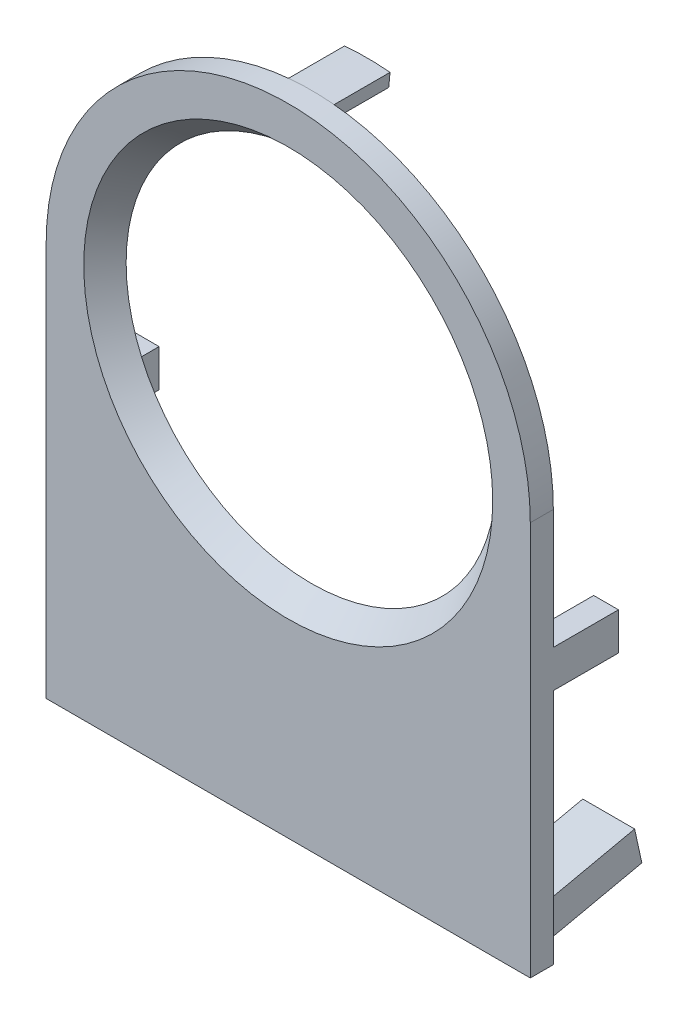
ISO-10303-21;
HEADER;
FILE_DESCRIPTION(('STEP AP214'),'2;1');
FILE_NAME('part.step','',(''),(''),'','','');
FILE_SCHEMA(('AUTOMOTIVE_DESIGN { 1 0 10303 214 1 1 1 1 }'));
ENDSEC;
DATA;
#1=APPLICATION_CONTEXT('core data for automotive mechanical design processes');
#2=APPLICATION_PROTOCOL_DEFINITION('international standard','automotive_design',2000,#1);
#3=PRODUCT_CONTEXT('',#1,'mechanical');
#4=PRODUCT('Part','Part','',(#3));
#5=PRODUCT_RELATED_PRODUCT_CATEGORY('part','',(#4));
#6=PRODUCT_DEFINITION_FORMATION('','',#4);
#7=PRODUCT_DEFINITION_CONTEXT('part definition',#1,'design');
#8=PRODUCT_DEFINITION('design','',#6,#7);
#9=PRODUCT_DEFINITION_SHAPE('','',#8);
#10=(LENGTH_UNIT() NAMED_UNIT(*) SI_UNIT(.MILLI.,.METRE.));
#11=(NAMED_UNIT(*) PLANE_ANGLE_UNIT() SI_UNIT($,.RADIAN.));
#12=(NAMED_UNIT(*) SI_UNIT($,.STERADIAN.) SOLID_ANGLE_UNIT());
#13=UNCERTAINTY_MEASURE_WITH_UNIT(LENGTH_MEASURE(1.E-05),#10,'distance_accuracy_value','');
#14=(GEOMETRIC_REPRESENTATION_CONTEXT(3) GLOBAL_UNCERTAINTY_ASSIGNED_CONTEXT((#13)) GLOBAL_UNIT_ASSIGNED_CONTEXT((#10,
#11,#12)) REPRESENTATION_CONTEXT('',''));
#15=CARTESIAN_POINT('',(0.,0.,0.));
#16=DIRECTION('',(0.,0.,1.));
#17=DIRECTION('',(1.,0.,0.));
#18=AXIS2_PLACEMENT_3D('',#15,#16,#17);
#19=CARTESIAN_POINT('',(0.,0.,42.));
#20=DIRECTION('',(0.,0.,1.));
#21=DIRECTION('',(1.,0.,0.));
#22=AXIS2_PLACEMENT_3D('',#19,#20,#21);
#23=PLANE('',#22);
#24=CARTESIAN_POINT('',(0.,0.,42.));
#25=DIRECTION('',(0.,0.,1.));
#26=DIRECTION('',(1.,0.,0.));
#27=AXIS2_PLACEMENT_3D('',#24,#25,#26);
#28=CIRCLE('',#27,16.0618007376455);
#29=CARTESIAN_POINT('',(16.0618007376455,0.,42.));
#30=VERTEX_POINT('',#29);
#31=EDGE_CURVE('E50',#30,#30,#28,.T.);
#32=ORIENTED_EDGE('',*,*,#31,.T.);
#33=EDGE_LOOP('',(#32));
#34=FACE_BOUND('',#33,.T.);
#35=DIRECTION('',(0.,-1.,0.));
#36=VECTOR('',#35,1.);
#37=CARTESIAN_POINT('',(-19.25,-21.4379492860773,42.));
#38=LINE('',#37,#36);
#39=CARTESIAN_POINT('',(-19.25,-31.2047703418054,42.));
#40=VERTEX_POINT('',#39);
#41=CARTESIAN_POINT('',(-19.25,-34.2047703418054,42.));
#42=VERTEX_POINT('',#41);
#43=EDGE_CURVE('E225',#40,#42,#38,.T.);
#44=ORIENTED_EDGE('',*,*,#43,.T.);
#45=DIRECTION('',(1.,0.,0.));
#46=VECTOR('',#45,1.);
#47=CARTESIAN_POINT('',(-21.,-34.2047703418054,42.));
#48=LINE('',#47,#46);
#49=CARTESIAN_POINT('',(-21.,-34.2047703418054,42.));
#50=VERTEX_POINT('',#49);
#51=EDGE_CURVE('E361',#50,#42,#48,.T.);
#52=ORIENTED_EDGE('',*,*,#51,.F.);
#53=DIRECTION('',(0.,-1.,0.));
#54=VECTOR('',#53,1.);
#55=CARTESIAN_POINT('',(-21.,-14.0641329223108,42.));
#56=LINE('',#55,#54);
#57=CARTESIAN_POINT('',(-21.,-13.7641329223108,42.));
#58=VERTEX_POINT('',#57);
#59=EDGE_CURVE('E297',#58,#50,#56,.T.);
#60=ORIENTED_EDGE('',*,*,#59,.F.);
#61=DIRECTION('',(1.,0.,0.));
#62=VECTOR('',#61,1.);
#63=CARTESIAN_POINT('',(-21.,-13.7641329223108,42.));
#64=LINE('',#63,#62);
#65=CARTESIAN_POINT('',(-18.85,-13.7641329223108,42.));
#66=VERTEX_POINT('',#65);
#67=EDGE_CURVE('E465',#58,#66,#64,.T.);
#68=ORIENTED_EDGE('',*,*,#67,.T.);
#69=DIRECTION('',(0.,1.,0.));
#70=VECTOR('',#69,1.);
#71=CARTESIAN_POINT('',(-18.85,-10.2141329223108,42.));
#72=LINE('',#71,#70);
#73=CARTESIAN_POINT('',(-18.85,-10.5141329223108,42.));
#74=VERTEX_POINT('',#73);
#75=EDGE_CURVE('E490',#66,#74,#72,.T.);
#76=ORIENTED_EDGE('',*,*,#75,.T.);
#77=DIRECTION('',(-1.,0.,0.));
#78=VECTOR('',#77,1.);
#79=CARTESIAN_POINT('',(-18.85,-10.5141329223108,42.));
#80=LINE('',#79,#78);
#81=CARTESIAN_POINT('',(-21.,-10.5141329223108,42.));
#82=VERTEX_POINT('',#81);
#83=EDGE_CURVE('E472',#74,#82,#80,.T.);
#84=ORIENTED_EDGE('',*,*,#83,.T.);
#85=CARTESIAN_POINT('',(-21.,0.,42.));
#86=VERTEX_POINT('',#85);
#87=EDGE_CURVE('E304',#86,#82,#56,.T.);
#88=ORIENTED_EDGE('',*,*,#87,.F.);
#89=CARTESIAN_POINT('',(0.,0.,42.));
#90=DIRECTION('',(0.,0.,1.));
#91=DIRECTION('',(1.,0.,0.));
#92=AXIS2_PLACEMENT_3D('',#89,#90,#91);
#93=CIRCLE('',#92,21.);
#94=CARTESIAN_POINT('',(-1.78913083156493,20.9236471693523,42.));
#95=VERTEX_POINT('',#94);
#96=EDGE_CURVE('E307',#95,#86,#93,.T.);
#97=ORIENTED_EDGE('',*,*,#96,.F.);
#98=CARTESIAN_POINT('',(1.98333797025892,20.9060681525341,42.));
#99=CARTESIAN_POINT('',(1.32410684495105,20.9688240892851,42.));
#100=CARTESIAN_POINT('',(0.00385608887355169,21.0318291108314,42.));
#101=CARTESIAN_POINT('',(-1.31639466720395,20.9691910581041,42.));
#102=CARTESIAN_POINT('',(-1.97181873184604,20.9071615352025,42.));
#103=B_SPLINE_CURVE_WITH_KNOTS('',3,(#98,#99,#100,#101,#102),.UNSPECIFIED.,.F.,.F.,(4,1,4),
(0.632808650119649,0.654019793730495,0.675107394358108),.UNSPECIFIED.);
#104=CARTESIAN_POINT('',(-1.97181873184604,20.9071615352025,42.));
#105=VERTEX_POINT('',#104);
#106=EDGE_CURVE('E234',#95,#105,#103,.T.);
#107=ORIENTED_EDGE('',*,*,#106,.T.);
#108=DIRECTION('',(0.0942192787541509,-0.99555146904168,0.));
#109=VECTOR('',#108,1.);
#110=CARTESIAN_POINT('',(-1.85894403589857,19.7144908752906,42.));
#111=LINE('',#110,#109);
#112=CARTESIAN_POINT('',(-1.85894403589857,19.7144908752906,42.));
#113=VERTEX_POINT('',#112);
#114=EDGE_CURVE('E340',#105,#113,#111,.T.);
#115=ORIENTED_EDGE('',*,*,#114,.T.);
#116=CARTESIAN_POINT('',(-1.85894403589857,19.7144908752906,42.));
#117=CARTESIAN_POINT('',(-1.54909634243908,19.7438149505485,42.));
#118=CARTESIAN_POINT('',(-0.927804945098241,19.7878796223772,42.));
#119=CARTESIAN_POINT('',(0.00545184072156578,19.8098164315136,42.));
#120=CARTESIAN_POINT('',(0.938704489057926,19.7873617674215,42.));
#121=CARTESIAN_POINT('',(1.55997378818764,19.7429545593892,42.));
#122=CARTESIAN_POINT('',(1.86980684063082,19.7134597999701,42.));
#123=B_SPLINE_CURVE_WITH_KNOTS('',3,(#116,#117,#118,#119,#120,#121,#122),.UNSPECIFIED.,.F.,.F.,
(4,1,1,1,4),(0.632808650119649,0.643383336179264,0.653958022238878,0.664532708298493,
0.675107394358108),.UNSPECIFIED.);
#124=CARTESIAN_POINT('',(1.86980684063082,19.7134597999701,42.));
#125=VERTEX_POINT('',#124);
#126=EDGE_CURVE('E586',#113,#125,#123,.T.);
#127=ORIENTED_EDGE('',*,*,#126,.T.);
#128=DIRECTION('',(0.0947672200568778,0.995499459569261,0.));
#129=VECTOR('',#128,1.);
#130=CARTESIAN_POINT('',(1.86980684063082,19.7134597999701,42.));
#131=LINE('',#130,#129);
#132=CARTESIAN_POINT('',(1.98333797025896,20.9060681525341,42.));
#133=VERTEX_POINT('',#132);
#134=EDGE_CURVE('E331',#125,#133,#131,.T.);
#135=ORIENTED_EDGE('',*,*,#134,.T.);
#136=CARTESIAN_POINT('',(1.78913083154189,20.9236471693542,42.));
#137=VERTEX_POINT('',#136);
#138=EDGE_CURVE('E337',#133,#137,#103,.T.);
#139=ORIENTED_EDGE('',*,*,#138,.T.);
#140=CARTESIAN_POINT('',(21.,0.,42.));
#141=VERTEX_POINT('',#140);
#142=EDGE_CURVE('E288',#141,#137,#93,.T.);
#143=ORIENTED_EDGE('',*,*,#142,.F.);
#144=DIRECTION('',(0.,1.,0.));
#145=VECTOR('',#144,1.);
#146=CARTESIAN_POINT('',(21.,0.,42.));
#147=LINE('',#146,#145);
#148=CARTESIAN_POINT('',(21.,-10.3641329223108,42.));
#149=VERTEX_POINT('',#148);
#150=EDGE_CURVE('E311',#149,#141,#147,.T.);
#151=ORIENTED_EDGE('',*,*,#150,.F.);
#152=DIRECTION('',(-1.,0.,0.));
#153=VECTOR('',#152,1.);
#154=CARTESIAN_POINT('',(18.85,-10.3641329223108,42.));
#155=LINE('',#154,#153);
#156=CARTESIAN_POINT('',(18.85,-10.3641329223108,42.));
#157=VERTEX_POINT('',#156);
#158=EDGE_CURVE('E484',#149,#157,#155,.T.);
#159=ORIENTED_EDGE('',*,*,#158,.T.);
#160=DIRECTION('',(0.,-1.,0.));
#161=VECTOR('',#160,1.);
#162=CARTESIAN_POINT('',(18.85,-10.0641329223108,42.));
#163=LINE('',#162,#161);
#164=CARTESIAN_POINT('',(18.85,-13.6141329223108,42.));
#165=VERTEX_POINT('',#164);
#166=EDGE_CURVE('E341',#157,#165,#163,.T.);
#167=ORIENTED_EDGE('',*,*,#166,.T.);
#168=DIRECTION('',(1.,0.,0.));
#169=VECTOR('',#168,1.);
#170=CARTESIAN_POINT('',(18.85,-13.6141329223108,42.));
#171=LINE('',#170,#169);
#172=CARTESIAN_POINT('',(21.,-13.6141329223108,42.));
#173=VERTEX_POINT('',#172);
#174=EDGE_CURVE('E474',#165,#173,#171,.T.);
#175=ORIENTED_EDGE('',*,*,#174,.T.);
#176=CARTESIAN_POINT('',(21.,-34.2047703418054,42.));
#177=VERTEX_POINT('',#176);
#178=EDGE_CURVE('E302',#177,#173,#147,.T.);
#179=ORIENTED_EDGE('',*,*,#178,.F.);
#180=CARTESIAN_POINT('',(19.25,-34.2047703418054,42.));
#181=VERTEX_POINT('',#180);
#182=EDGE_CURVE('E364',#181,#177,#48,.T.);
#183=ORIENTED_EDGE('',*,*,#182,.F.);
#184=DIRECTION('',(0.,-1.,0.));
#185=VECTOR('',#184,1.);
#186=CARTESIAN_POINT('',(19.25,-21.4379492860773,42.));
#187=LINE('',#186,#185);
#188=CARTESIAN_POINT('',(19.25,-31.2047703418054,42.));
#189=VERTEX_POINT('',#188);
#190=EDGE_CURVE('E409',#189,#181,#187,.T.);
#191=ORIENTED_EDGE('',*,*,#190,.F.);
#192=DIRECTION('',(-1.,0.,0.));
#193=VECTOR('',#192,1.);
#194=CARTESIAN_POINT('',(19.5,-31.2047703418054,42.));
#195=LINE('',#194,#193);
#196=CARTESIAN_POINT('',(14.75,-31.2047703418054,42.));
#197=VERTEX_POINT('',#196);
#198=EDGE_CURVE('E455',#189,#197,#195,.T.);
#199=ORIENTED_EDGE('',*,*,#198,.T.);
#200=DIRECTION('',(0.,-1.,0.));
#201=VECTOR('',#200,1.);
#202=CARTESIAN_POINT('',(14.75,-21.4379492860773,42.));
#203=LINE('',#202,#201);
#204=CARTESIAN_POINT('',(14.75,-34.2047703418054,42.));
#205=VERTEX_POINT('',#204);
#206=EDGE_CURVE('E400',#197,#205,#203,.T.);
#207=ORIENTED_EDGE('',*,*,#206,.T.);
#208=CARTESIAN_POINT('',(-14.75,-34.2047703418054,42.));
#209=VERTEX_POINT('',#208);
#210=EDGE_CURVE('E363',#209,#205,#48,.T.);
#211=ORIENTED_EDGE('',*,*,#210,.F.);
#212=DIRECTION('',(0.,-1.,0.));
#213=VECTOR('',#212,1.);
#214=CARTESIAN_POINT('',(-14.75,-21.4379492860773,42.));
#215=LINE('',#214,#213);
#216=CARTESIAN_POINT('',(-14.75,-31.2047703418054,42.));
#217=VERTEX_POINT('',#216);
#218=EDGE_CURVE('E390',#217,#209,#215,.T.);
#219=ORIENTED_EDGE('',*,*,#218,.F.);
#220=DIRECTION('',(1.,0.,0.));
#221=VECTOR('',#220,1.);
#222=CARTESIAN_POINT('',(-19.5,-31.2047703418054,42.));
#223=LINE('',#222,#221);
#224=EDGE_CURVE('E385',#40,#217,#223,.T.);
#225=ORIENTED_EDGE('',*,*,#224,.F.);
#226=EDGE_LOOP('',(#44,#52,#60,#68,#76,#84,#88,#97,#107,#115,#127,#135,#139,#143,#151,#159,#167,
#175,#179,#183,#191,#199,#207,#211,#219,#225));
#227=FACE_BOUND('',#226,.T.);
#228=ADVANCED_FACE('F41',(#34,#227),#23,.F.);
#229=CARTESIAN_POINT('',(0.,0.,44.));
#230=DIRECTION('',(0.,0.,1.));
#231=DIRECTION('',(1.,0.,0.));
#232=AXIS2_PLACEMENT_3D('',#229,#230,#231);
#233=PLANE('',#232);
#234=CARTESIAN_POINT('',(0.,0.,44.));
#235=DIRECTION('',(0.,0.,1.));
#236=DIRECTION('',(1.,0.,0.));
#237=AXIS2_PLACEMENT_3D('',#234,#235,#236);
#238=CIRCLE('',#237,17.74);
#239=CARTESIAN_POINT('',(17.74,0.,44.));
#240=VERTEX_POINT('',#239);
#241=EDGE_CURVE('E11',#240,#240,#238,.F.);
#242=ORIENTED_EDGE('',*,*,#241,.T.);
#243=EDGE_LOOP('',(#242));
#244=FACE_BOUND('',#243,.T.);
#245=DIRECTION('',(0.,1.,0.));
#246=VECTOR('',#245,1.);
#247=CARTESIAN_POINT('',(21.,-34.2047703418054,44.));
#248=LINE('',#247,#246);
#249=CARTESIAN_POINT('',(21.,-34.2047703418054,44.));
#250=VERTEX_POINT('',#249);
#251=CARTESIAN_POINT('',(21.,0.,44.));
#252=VERTEX_POINT('',#251);
#253=EDGE_CURVE('E362',#250,#252,#248,.T.);
#254=ORIENTED_EDGE('',*,*,#253,.T.);
#255=CARTESIAN_POINT('',(0.,0.,44.));
#256=DIRECTION('',(0.,0.,1.));
#257=DIRECTION('',(1.,0.,0.));
#258=AXIS2_PLACEMENT_3D('',#255,#256,#257);
#259=CIRCLE('',#258,21.);
#260=CARTESIAN_POINT('',(-21.,0.,44.));
#261=VERTEX_POINT('',#260);
#262=EDGE_CURVE('E367',#252,#261,#259,.T.);
#263=ORIENTED_EDGE('',*,*,#262,.T.);
#264=DIRECTION('',(0.,-1.,0.));
#265=VECTOR('',#264,1.);
#266=CARTESIAN_POINT('',(-21.,0.,44.));
#267=LINE('',#266,#265);
#268=CARTESIAN_POINT('',(-21.,-34.2047703418054,44.));
#269=VERTEX_POINT('',#268);
#270=EDGE_CURVE('E524',#261,#269,#267,.T.);
#271=ORIENTED_EDGE('',*,*,#270,.T.);
#272=DIRECTION('',(1.,0.,0.));
#273=VECTOR('',#272,1.);
#274=CARTESIAN_POINT('',(-21.,-34.2047703418054,44.));
#275=LINE('',#274,#273);
#276=EDGE_CURVE('E360',#269,#250,#275,.T.);
#277=ORIENTED_EDGE('',*,*,#276,.T.);
#278=EDGE_LOOP('',(#254,#263,#271,#277));
#279=FACE_BOUND('',#278,.T.);
#280=ADVANCED_FACE('F257',(#244,#279),#233,.T.);
#281=CARTESIAN_POINT('',(21.,0.,44.));
#282=DIRECTION('',(-1.,0.,0.));
#283=DIRECTION('',(0.,-1.,0.));
#284=AXIS2_PLACEMENT_3D('',#281,#282,#283);
#285=PLANE('',#284);
#286=DIRECTION('',(0.,0.,-1.));
#287=VECTOR('',#286,1.);
#288=CARTESIAN_POINT('',(21.,-13.6141329223108,44.1708293346092));
#289=LINE('',#288,#287);
#290=CARTESIAN_POINT('',(21.,-13.6141329223108,36.35));
#291=VERTEX_POINT('',#290);
#292=EDGE_CURVE('E471',#173,#291,#289,.T.);
#293=ORIENTED_EDGE('',*,*,#292,.T.);
#294=DIRECTION('',(0.,-1.,0.));
#295=VECTOR('',#294,1.);
#296=CARTESIAN_POINT('',(21.,-15.1139710254063,36.35));
#297=LINE('',#296,#295);
#298=CARTESIAN_POINT('',(21.,-10.3641329223108,36.35));
#299=VERTEX_POINT('',#298);
#300=EDGE_CURVE('E434',#299,#291,#297,.T.);
#301=ORIENTED_EDGE('',*,*,#300,.F.);
#302=DIRECTION('',(0.,0.,-1.));
#303=VECTOR('',#302,1.);
#304=CARTESIAN_POINT('',(21.,-10.3641329223108,44.1708293346092));
#305=LINE('',#304,#303);
#306=EDGE_CURVE('E477',#149,#299,#305,.T.);
#307=ORIENTED_EDGE('',*,*,#306,.F.);
#308=ORIENTED_EDGE('',*,*,#150,.T.);
#309=DIRECTION('',(0.,0.,-1.));
#310=VECTOR('',#309,1.);
#311=CARTESIAN_POINT('',(21.,0.,44.));
#312=LINE('',#311,#310);
#313=EDGE_CURVE('E347',#252,#141,#312,.T.);
#314=ORIENTED_EDGE('',*,*,#313,.F.);
#315=ORIENTED_EDGE('',*,*,#253,.F.);
#316=DIRECTION('',(0.,0.,-1.));
#317=VECTOR('',#316,1.);
#318=CARTESIAN_POINT('',(21.,-34.2047703418054,44.));
#319=LINE('',#318,#317);
#320=EDGE_CURVE('E359',#250,#177,#319,.T.);
#321=ORIENTED_EDGE('',*,*,#320,.T.);
#322=ORIENTED_EDGE('',*,*,#178,.T.);
#323=EDGE_LOOP('',(#293,#301,#307,#308,#314,#315,#321,#322));
#324=FACE_BOUND('',#323,.T.);
#325=ADVANCED_FACE('F263',(#324),#285,.F.);
#326=CARTESIAN_POINT('',(0.,0.,44.));
#327=DIRECTION('',(0.,0.,-1.));
#328=DIRECTION('',(-1.,0.,0.));
#329=AXIS2_PLACEMENT_3D('',#326,#327,#328);
#330=CYLINDRICAL_SURFACE('',#329,21.);
#331=ORIENTED_EDGE('',*,*,#142,.T.);
#332=CARTESIAN_POINT('',(-1.78913083156494,20.9236471693523,42.));
#333=CARTESIAN_POINT('',(-1.19413395904744,20.9747222381822,42.));
#334=CARTESIAN_POINT('',(-7.7056958903976E-12,21.0261149822509,42.));
#335=CARTESIAN_POINT('',(1.19413395903203,20.9747222381829,42.));
#336=CARTESIAN_POINT('',(1.7891308315419,20.9236471693543,42.));
#337=B_SPLINE_CURVE_WITH_KNOTS('',3,(#332,#333,#334,#335,#336),.UNSPECIFIED.,.F.,.F.,(4,1,4),
(0.634890712877089,0.654019793730742,0.673148874584148),.UNSPECIFIED.);
#338=EDGE_CURVE('E298',#137,#95,#337,.F.);
#339=ORIENTED_EDGE('',*,*,#338,.T.);
#340=ORIENTED_EDGE('',*,*,#96,.T.);
#341=DIRECTION('',(0.,0.,-1.));
#342=VECTOR('',#341,1.);
#343=CARTESIAN_POINT('',(-21.,0.,44.));
#344=LINE('',#343,#342);
#345=EDGE_CURVE('E353',#261,#86,#344,.T.);
#346=ORIENTED_EDGE('',*,*,#345,.F.);
#347=ORIENTED_EDGE('',*,*,#262,.F.);
#348=ORIENTED_EDGE('',*,*,#313,.T.);
#349=EDGE_LOOP('',(#331,#339,#340,#346,#347,#348));
#350=FACE_BOUND('',#349,.T.);
#351=ADVANCED_FACE('F276',(#350),#330,.T.);
#352=CARTESIAN_POINT('',(-21.,-14.0641329223108,44.));
#353=DIRECTION('',(1.,0.,0.));
#354=DIRECTION('',(0.,1.,0.));
#355=AXIS2_PLACEMENT_3D('',#352,#353,#354);
#356=PLANE('',#355);
#357=DIRECTION('',(0.,0.,-1.));
#358=VECTOR('',#357,1.);
#359=CARTESIAN_POINT('',(-21.,-10.5141329223108,44.1708293346092));
#360=LINE('',#359,#358);
#361=CARTESIAN_POINT('',(-21.,-10.5141329223108,36.35));
#362=VERTEX_POINT('',#361);
#363=EDGE_CURVE('E480',#82,#362,#360,.T.);
#364=ORIENTED_EDGE('',*,*,#363,.T.);
#365=DIRECTION('',(0.,-1.,0.));
#366=VECTOR('',#365,1.);
#367=CARTESIAN_POINT('',(-21.,-14.0641329223108,36.35));
#368=LINE('',#367,#366);
#369=CARTESIAN_POINT('',(-21.,-13.7641329223108,36.35));
#370=VERTEX_POINT('',#369);
#371=EDGE_CURVE('E439',#362,#370,#368,.T.);
#372=ORIENTED_EDGE('',*,*,#371,.T.);
#373=DIRECTION('',(0.,0.,-1.));
#374=VECTOR('',#373,1.);
#375=CARTESIAN_POINT('',(-21.,-13.7641329223108,44.1708293346092));
#376=LINE('',#375,#374);
#377=EDGE_CURVE('E379',#58,#370,#376,.T.);
#378=ORIENTED_EDGE('',*,*,#377,.F.);
#379=ORIENTED_EDGE('',*,*,#59,.T.);
#380=DIRECTION('',(0.,0.,-1.));
#381=VECTOR('',#380,1.);
#382=CARTESIAN_POINT('',(-21.,-34.2047703418054,44.));
#383=LINE('',#382,#381);
#384=EDGE_CURVE('E356',#269,#50,#383,.T.);
#385=ORIENTED_EDGE('',*,*,#384,.F.);
#386=ORIENTED_EDGE('',*,*,#270,.F.);
#387=ORIENTED_EDGE('',*,*,#345,.T.);
#388=ORIENTED_EDGE('',*,*,#87,.T.);
#389=EDGE_LOOP('',(#364,#372,#378,#379,#385,#386,#387,#388));
#390=FACE_BOUND('',#389,.T.);
#391=ADVANCED_FACE('F272',(#390),#356,.F.);
#392=CARTESIAN_POINT('',(-21.,-34.2047703418054,44.));
#393=DIRECTION('',(0.,1.,0.));
#394=DIRECTION('',(0.,0.,1.));
#395=AXIS2_PLACEMENT_3D('',#392,#393,#394);
#396=PLANE('',#395);
#397=ORIENTED_EDGE('',*,*,#51,.T.);
#398=DIRECTION('',(-1.,0.,0.));
#399=VECTOR('',#398,1.);
#400=CARTESIAN_POINT('',(-19.5,-34.2047703418054,42.));
#401=LINE('',#400,#399);
#402=EDGE_CURVE('E224',#209,#42,#401,.T.);
#403=ORIENTED_EDGE('',*,*,#402,.F.);
#404=ORIENTED_EDGE('',*,*,#210,.T.);
#405=DIRECTION('',(-1.,0.,0.));
#406=VECTOR('',#405,1.);
#407=CARTESIAN_POINT('',(19.5,-34.2047703418054,42.));
#408=LINE('',#407,#406);
#409=EDGE_CURVE('E458',#181,#205,#408,.T.);
#410=ORIENTED_EDGE('',*,*,#409,.F.);
#411=ORIENTED_EDGE('',*,*,#182,.T.);
#412=ORIENTED_EDGE('',*,*,#320,.F.);
#413=ORIENTED_EDGE('',*,*,#276,.F.);
#414=ORIENTED_EDGE('',*,*,#384,.T.);
#415=EDGE_LOOP('',(#397,#403,#404,#410,#411,#412,#413,#414));
#416=FACE_BOUND('',#415,.T.);
#417=ADVANCED_FACE('F268',(#416),#396,.F.);
#418=CARTESIAN_POINT('',(1.98333797025892,20.9060681525341,37.));
#419=CARTESIAN_POINT('',(1.32410684495105,20.9688240892851,37.));
#420=CARTESIAN_POINT('',(0.00385608887355169,21.0318291108314,37.));
#421=CARTESIAN_POINT('',(-1.31639466720395,20.9691910581041,37.));
#422=CARTESIAN_POINT('',(-1.97181873184604,20.9071615352025,37.));
#423=B_SPLINE_CURVE_WITH_KNOTS('',3,(#418,#419,#420,#421,#422),.UNSPECIFIED.,.F.,.F.,(4,1,4),
(0.632808650119649,0.654019793730495,0.675107394358108),.UNSPECIFIED.);
#424=DIRECTION('',(0.,0.,1.));
#425=VECTOR('',#424,1.);
#426=SURFACE_OF_LINEAR_EXTRUSION('',#423,#425);
#427=CARTESIAN_POINT('',(1.98333797025892,20.9060681525341,37.15));
#428=CARTESIAN_POINT('',(1.32410684495105,20.9688240892851,37.15));
#429=CARTESIAN_POINT('',(0.00385608887355169,21.0318291108314,37.15));
#430=CARTESIAN_POINT('',(-1.31639466720395,20.9691910581041,37.15));
#431=CARTESIAN_POINT('',(-1.97181873184604,20.9071615352025,37.15));
#432=B_SPLINE_CURVE_WITH_KNOTS('',3,(#427,#428,#429,#430,#431),.UNSPECIFIED.,.F.,.F.,(4,1,4),
(0.632808650119649,0.654019793730495,0.675107394358108),.UNSPECIFIED.);
#433=CARTESIAN_POINT('',(-1.97181873184604,20.9071615352025,37.15));
#434=VERTEX_POINT('',#433);
#435=CARTESIAN_POINT('',(1.98333797025896,20.9060681525341,37.15));
#436=VERTEX_POINT('',#435);
#437=EDGE_CURVE('E418',#434,#436,#432,.F.);
#438=ORIENTED_EDGE('',*,*,#437,.F.);
#439=DIRECTION('',(0.,0.,1.));
#440=VECTOR('',#439,1.);
#441=CARTESIAN_POINT('',(-1.97181873184604,20.9071615352025,37.));
#442=LINE('',#441,#440);
#443=EDGE_CURVE('E335',#434,#105,#442,.T.);
#444=ORIENTED_EDGE('',*,*,#443,.T.);
#445=ORIENTED_EDGE('',*,*,#106,.F.);
#446=ORIENTED_EDGE('',*,*,#338,.F.);
#447=ORIENTED_EDGE('',*,*,#138,.F.);
#448=DIRECTION('',(0.,0.,1.));
#449=VECTOR('',#448,1.);
#450=CARTESIAN_POINT('',(1.98333797025896,20.9060681525341,37.));
#451=LINE('',#450,#449);
#452=EDGE_CURVE('E317',#436,#133,#451,.T.);
#453=ORIENTED_EDGE('',*,*,#452,.F.);
#454=EDGE_LOOP('',(#438,#444,#445,#446,#447,#453));
#455=FACE_BOUND('',#454,.T.);
#456=ADVANCED_FACE('F271',(#455),#426,.T.);
#457=CARTESIAN_POINT('',(1.86980684063082,19.7134597999701,37.));
#458=DIRECTION('',(0.995499459569261,-0.0947672200568778,0.));
#459=DIRECTION('',(0.0947672200568778,0.995499459569261,0.));
#460=AXIS2_PLACEMENT_3D('',#457,#458,#459);
#461=PLANE('',#460);
#462=DIRECTION('',(-0.0947672200568778,-0.995499459569261,0.));
#463=VECTOR('',#462,1.);
#464=CARTESIAN_POINT('',(2.06990503626383,21.8154276058622,37.15));
#465=LINE('',#464,#463);
#466=CARTESIAN_POINT('',(1.86980684063082,19.7134597999701,37.15));
#467=VERTEX_POINT('',#466);
#468=EDGE_CURVE('E412',#436,#467,#465,.T.);
#469=ORIENTED_EDGE('',*,*,#468,.F.);
#470=ORIENTED_EDGE('',*,*,#452,.T.);
#471=ORIENTED_EDGE('',*,*,#134,.F.);
#472=DIRECTION('',(0.,0.,1.));
#473=VECTOR('',#472,1.);
#474=CARTESIAN_POINT('',(1.86980684063082,19.7134597999701,37.));
#475=LINE('',#474,#473);
#476=EDGE_CURVE('E321',#467,#125,#475,.T.);
#477=ORIENTED_EDGE('',*,*,#476,.F.);
#478=EDGE_LOOP('',(#469,#470,#471,#477));
#479=FACE_BOUND('',#478,.T.);
#480=ADVANCED_FACE('F511',(#479),#461,.T.);
#481=CARTESIAN_POINT('',(-1.85894403589857,19.7144908752906,37.));
#482=CARTESIAN_POINT('',(-1.54909634243908,19.7438149505485,37.));
#483=CARTESIAN_POINT('',(-0.927804945098241,19.7878796223772,37.));
#484=CARTESIAN_POINT('',(0.00545184072156578,19.8098164315136,37.));
#485=CARTESIAN_POINT('',(0.938704489057926,19.7873617674215,37.));
#486=CARTESIAN_POINT('',(1.55997378818764,19.7429545593892,37.));
#487=CARTESIAN_POINT('',(1.86980684063082,19.7134597999701,37.));
#488=B_SPLINE_CURVE_WITH_KNOTS('',3,(#481,#482,#483,#484,#485,#486,#487),.UNSPECIFIED.,.F.,.F.,
(4,1,1,1,4),(0.632808650119649,0.643383336179264,0.653958022238878,0.664532708298493,
0.675107394358108),.UNSPECIFIED.);
#489=DIRECTION('',(0.,0.,1.));
#490=VECTOR('',#489,1.);
#491=SURFACE_OF_LINEAR_EXTRUSION('',#488,#490);
#492=CARTESIAN_POINT('',(-1.85894403589857,19.7144908752906,37.15));
#493=CARTESIAN_POINT('',(-1.54909634243908,19.7438149505485,37.15));
#494=CARTESIAN_POINT('',(-0.927804945098241,19.7878796223772,37.15));
#495=CARTESIAN_POINT('',(0.00545184072156578,19.8098164315136,37.15));
#496=CARTESIAN_POINT('',(0.938704489057926,19.7873617674215,37.15));
#497=CARTESIAN_POINT('',(1.55997378818764,19.7429545593892,37.15));
#498=CARTESIAN_POINT('',(1.86980684063082,19.7134597999701,37.15));
#499=B_SPLINE_CURVE_WITH_KNOTS('',3,(#492,#493,#494,#495,#496,#497,#498),.UNSPECIFIED.,.F.,.F.,
(4,1,1,1,4),(0.632808650119649,0.643383336179264,0.653958022238878,0.664532708298493,
0.675107394358108),.UNSPECIFIED.);
#500=CARTESIAN_POINT('',(-1.85894403589857,19.7144908752906,37.15));
#501=VERTEX_POINT('',#500);
#502=EDGE_CURVE('E414',#467,#501,#499,.F.);
#503=ORIENTED_EDGE('',*,*,#502,.F.);
#504=ORIENTED_EDGE('',*,*,#476,.T.);
#505=ORIENTED_EDGE('',*,*,#126,.F.);
#506=DIRECTION('',(0.,0.,1.));
#507=VECTOR('',#506,1.);
#508=CARTESIAN_POINT('',(-1.85894403589857,19.7144908752906,37.));
#509=LINE('',#508,#507);
#510=EDGE_CURVE('E328',#501,#113,#509,.T.);
#511=ORIENTED_EDGE('',*,*,#510,.F.);
#512=EDGE_LOOP('',(#503,#504,#505,#511));
#513=FACE_BOUND('',#512,.T.);
#514=ADVANCED_FACE('F573',(#513),#491,.T.);
#515=CARTESIAN_POINT('',(-1.85894403589857,19.7144908752906,37.));
#516=DIRECTION('',(-0.99555146904168,-0.0942192787541509,0.));
#517=DIRECTION('',(0.0942192787541509,-0.99555146904168,0.));
#518=AXIS2_PLACEMENT_3D('',#515,#516,#517);
#519=PLANE('',#518);
#520=DIRECTION('',(-0.0942192787541509,0.99555146904168,0.));
#521=VECTOR('',#520,1.);
#522=CARTESIAN_POINT('',(-1.85894403589857,19.7144908752906,37.15));
#523=LINE('',#522,#521);
#524=EDGE_CURVE('E228',#501,#434,#523,.T.);
#525=ORIENTED_EDGE('',*,*,#524,.F.);
#526=ORIENTED_EDGE('',*,*,#510,.T.);
#527=ORIENTED_EDGE('',*,*,#114,.F.);
#528=ORIENTED_EDGE('',*,*,#443,.F.);
#529=EDGE_LOOP('',(#525,#526,#527,#528));
#530=FACE_BOUND('',#529,.T.);
#531=ADVANCED_FACE('F513',(#530),#519,.T.);
#532=CARTESIAN_POINT('',(-18.85,-10.2141329223108,46.380314673286));
#533=DIRECTION('',(-1.,0.,0.));
#534=DIRECTION('',(0.,0.,1.));
#535=AXIS2_PLACEMENT_3D('',#532,#533,#534);
#536=PLANE('',#535);
#537=DIRECTION('',(0.,0.,-1.));
#538=VECTOR('',#537,1.);
#539=CARTESIAN_POINT('',(-18.85,-13.7641329223108,44.1708293346092));
#540=LINE('',#539,#538);
#541=CARTESIAN_POINT('',(-18.85,-13.7641329223108,36.35));
#542=VERTEX_POINT('',#541);
#543=EDGE_CURVE('E462',#66,#542,#540,.T.);
#544=ORIENTED_EDGE('',*,*,#543,.T.);
#545=DIRECTION('',(0.,1.,0.));
#546=VECTOR('',#545,1.);
#547=CARTESIAN_POINT('',(-18.85,-10.2141329223108,36.35));
#548=LINE('',#547,#546);
#549=CARTESIAN_POINT('',(-18.85,-10.5141329223108,36.35));
#550=VERTEX_POINT('',#549);
#551=EDGE_CURVE('E436',#542,#550,#548,.T.);
#552=ORIENTED_EDGE('',*,*,#551,.T.);
#553=DIRECTION('',(0.,0.,-1.));
#554=VECTOR('',#553,1.);
#555=CARTESIAN_POINT('',(-18.85,-10.5141329223108,44.1708293346092));
#556=LINE('',#555,#554);
#557=EDGE_CURVE('E467',#74,#550,#556,.T.);
#558=ORIENTED_EDGE('',*,*,#557,.F.);
#559=ORIENTED_EDGE('',*,*,#75,.F.);
#560=EDGE_LOOP('',(#544,#552,#558,#559));
#561=FACE_BOUND('',#560,.T.);
#562=ADVANCED_FACE('F542',(#561),#536,.F.);
#563=CARTESIAN_POINT('',(18.85,-10.0641329223108,46.380314673286));
#564=DIRECTION('',(1.,0.,0.));
#565=DIRECTION('',(0.,0.,-1.));
#566=AXIS2_PLACEMENT_3D('',#563,#564,#565);
#567=PLANE('',#566);
#568=DIRECTION('',(0.,0.,-1.));
#569=VECTOR('',#568,1.);
#570=CARTESIAN_POINT('',(18.85,-10.3641329223108,44.1708293346092));
#571=LINE('',#570,#569);
#572=CARTESIAN_POINT('',(18.85,-10.3641329223108,36.35));
#573=VERTEX_POINT('',#572);
#574=EDGE_CURVE('E487',#157,#573,#571,.T.);
#575=ORIENTED_EDGE('',*,*,#574,.T.);
#576=DIRECTION('',(0.,-1.,0.));
#577=VECTOR('',#576,1.);
#578=CARTESIAN_POINT('',(18.85,-10.0641329223108,36.35));
#579=LINE('',#578,#577);
#580=CARTESIAN_POINT('',(18.85,-13.6141329223108,36.35));
#581=VERTEX_POINT('',#580);
#582=EDGE_CURVE('E447',#573,#581,#579,.T.);
#583=ORIENTED_EDGE('',*,*,#582,.T.);
#584=DIRECTION('',(0.,0.,-1.));
#585=VECTOR('',#584,1.);
#586=CARTESIAN_POINT('',(18.85,-13.6141329223108,44.1708293346092));
#587=LINE('',#586,#585);
#588=EDGE_CURVE('E468',#165,#581,#587,.T.);
#589=ORIENTED_EDGE('',*,*,#588,.F.);
#590=ORIENTED_EDGE('',*,*,#166,.F.);
#591=EDGE_LOOP('',(#575,#583,#589,#590));
#592=FACE_BOUND('',#591,.T.);
#593=ADVANCED_FACE('F565',(#592),#567,.F.);
#594=CARTESIAN_POINT('',(18.85,-10.3641329223108,44.1708293346092));
#595=DIRECTION('',(0.,-1.,0.));
#596=DIRECTION('',(0.,0.,-1.));
#597=AXIS2_PLACEMENT_3D('',#594,#595,#596);
#598=PLANE('',#597);
#599=ORIENTED_EDGE('',*,*,#306,.T.);
#600=DIRECTION('',(-1.,0.,0.));
#601=VECTOR('',#600,1.);
#602=CARTESIAN_POINT('',(18.85,-10.3641329223108,36.35));
#603=LINE('',#602,#601);
#604=EDGE_CURVE('E450',#299,#573,#603,.T.);
#605=ORIENTED_EDGE('',*,*,#604,.T.);
#606=ORIENTED_EDGE('',*,*,#574,.F.);
#607=ORIENTED_EDGE('',*,*,#158,.F.);
#608=EDGE_LOOP('',(#599,#605,#606,#607));
#609=FACE_BOUND('',#608,.T.);
#610=ADVANCED_FACE('F556',(#609),#598,.F.);
#611=CARTESIAN_POINT('',(18.85,-13.6141329223108,44.1708293346092));
#612=DIRECTION('',(0.,1.,0.));
#613=DIRECTION('',(0.,0.,1.));
#614=AXIS2_PLACEMENT_3D('',#611,#612,#613);
#615=PLANE('',#614);
#616=ORIENTED_EDGE('',*,*,#588,.T.);
#617=DIRECTION('',(1.,0.,0.));
#618=VECTOR('',#617,1.);
#619=CARTESIAN_POINT('',(18.85,-13.6141329223108,36.35));
#620=LINE('',#619,#618);
#621=EDGE_CURVE('E444',#581,#291,#620,.T.);
#622=ORIENTED_EDGE('',*,*,#621,.T.);
#623=ORIENTED_EDGE('',*,*,#292,.F.);
#624=ORIENTED_EDGE('',*,*,#174,.F.);
#625=EDGE_LOOP('',(#616,#622,#623,#624));
#626=FACE_BOUND('',#625,.T.);
#627=ADVANCED_FACE('F548',(#626),#615,.F.);
#628=CARTESIAN_POINT('',(-21.,-13.7641329223108,44.1708293346092));
#629=DIRECTION('',(0.,1.,0.));
#630=DIRECTION('',(0.,0.,1.));
#631=AXIS2_PLACEMENT_3D('',#628,#629,#630);
#632=PLANE('',#631);
#633=ORIENTED_EDGE('',*,*,#377,.T.);
#634=DIRECTION('',(1.,0.,0.));
#635=VECTOR('',#634,1.);
#636=CARTESIAN_POINT('',(-21.,-13.7641329223108,36.35));
#637=LINE('',#636,#635);
#638=EDGE_CURVE('E441',#370,#542,#637,.T.);
#639=ORIENTED_EDGE('',*,*,#638,.T.);
#640=ORIENTED_EDGE('',*,*,#543,.F.);
#641=ORIENTED_EDGE('',*,*,#67,.F.);
#642=EDGE_LOOP('',(#633,#639,#640,#641));
#643=FACE_BOUND('',#642,.T.);
#644=ADVANCED_FACE('F546',(#643),#632,.F.);
#645=CARTESIAN_POINT('',(-18.85,-10.5141329223108,44.1708293346092));
#646=DIRECTION('',(0.,-1.,0.));
#647=DIRECTION('',(0.,0.,-1.));
#648=AXIS2_PLACEMENT_3D('',#645,#646,#647);
#649=PLANE('',#648);
#650=ORIENTED_EDGE('',*,*,#557,.T.);
#651=DIRECTION('',(-1.,0.,0.));
#652=VECTOR('',#651,1.);
#653=CARTESIAN_POINT('',(-18.85,-10.5141329223108,36.35));
#654=LINE('',#653,#652);
#655=EDGE_CURVE('E229',#550,#362,#654,.T.);
#656=ORIENTED_EDGE('',*,*,#655,.T.);
#657=ORIENTED_EDGE('',*,*,#363,.F.);
#658=ORIENTED_EDGE('',*,*,#83,.F.);
#659=EDGE_LOOP('',(#650,#656,#657,#658));
#660=FACE_BOUND('',#659,.T.);
#661=ADVANCED_FACE('F540',(#660),#649,.F.);
#662=CARTESIAN_POINT('',(19.5,-32.072761245289,32.2299162126228));
#663=DIRECTION('',(0.,0.977008378737724,0.213200909651636));
#664=DIRECTION('',(0.,-0.213200909651636,0.977008378737724));
#665=AXIS2_PLACEMENT_3D('',#662,#663,#664);
#666=PLANE('',#665);
#667=ORIENTED_EDGE('',*,*,#409,.T.);
#668=DIRECTION('',(0.,-0.213200909651636,0.977008378737724));
#669=VECTOR('',#668,1.);
#670=CARTESIAN_POINT('',(14.75,-32.1473815636671,32.571869145181));
#671=LINE('',#670,#669);
#672=CARTESIAN_POINT('',(14.75,-32.1473815636671,32.571869145181));
#673=VERTEX_POINT('',#672);
#674=EDGE_CURVE('E387',#673,#205,#671,.T.);
#675=ORIENTED_EDGE('',*,*,#674,.F.);
#676=DIRECTION('',(1.,0.,0.));
#677=VECTOR('',#676,1.);
#678=CARTESIAN_POINT('',(19.5,-32.1473815636671,32.571869145181));
#679=LINE('',#678,#677);
#680=CARTESIAN_POINT('',(19.25,-32.1473815636671,32.571869145181));
#681=VERTEX_POINT('',#680);
#682=EDGE_CURVE('E432',#673,#681,#679,.T.);
#683=ORIENTED_EDGE('',*,*,#682,.T.);
#684=DIRECTION('',(0.,0.213200909651636,-0.977008378737723));
#685=VECTOR('',#684,1.);
#686=CARTESIAN_POINT('',(19.25,-34.2047703418054,42.));
#687=LINE('',#686,#685);
#688=EDGE_CURVE('E403',#181,#681,#687,.T.);
#689=ORIENTED_EDGE('',*,*,#688,.F.);
#690=EDGE_LOOP('',(#667,#675,#683,#689));
#691=FACE_BOUND('',#690,.T.);
#692=ADVANCED_FACE('F554',(#691),#666,.F.);
#693=CARTESIAN_POINT('',(19.5,-29.072761245289,32.2299162126228));
#694=DIRECTION('',(0.,0.977008378737724,0.213200909651636));
#695=DIRECTION('',(0.,-0.213200909651636,0.977008378737724));
#696=AXIS2_PLACEMENT_3D('',#693,#694,#695);
#697=PLANE('',#696);
#698=DIRECTION('',(0.,-0.213200909651636,0.977008378737724));
#699=VECTOR('',#698,1.);
#700=CARTESIAN_POINT('',(14.75,-28.7034343470447,30.5374493527604));
#701=LINE('',#700,#699);
#702=CARTESIAN_POINT('',(14.75,-29.283745447296,33.1967663704334));
#703=VERTEX_POINT('',#702);
#704=EDGE_CURVE('E397',#703,#197,#701,.T.);
#705=ORIENTED_EDGE('',*,*,#704,.T.);
#706=ORIENTED_EDGE('',*,*,#198,.F.);
#707=DIRECTION('',(0.,0.213200909651636,-0.977008378737724));
#708=VECTOR('',#707,1.);
#709=CARTESIAN_POINT('',(19.25,-30.760823125183,39.9655802075794));
#710=LINE('',#709,#708);
#711=CARTESIAN_POINT('',(19.25,-29.283745447296,33.1967663704334));
#712=VERTEX_POINT('',#711);
#713=EDGE_CURVE('E406',#189,#712,#710,.T.);
#714=ORIENTED_EDGE('',*,*,#713,.T.);
#715=DIRECTION('',(1.,0.,0.));
#716=VECTOR('',#715,1.);
#717=CARTESIAN_POINT('',(19.5,-29.283745447296,33.1967663704334));
#718=LINE('',#717,#716);
#719=EDGE_CURVE('E430',#703,#712,#718,.T.);
#720=ORIENTED_EDGE('',*,*,#719,.F.);
#721=EDGE_LOOP('',(#705,#706,#714,#720));
#722=FACE_BOUND('',#721,.T.);
#723=ADVANCED_FACE('F560',(#722),#697,.T.);
#724=CARTESIAN_POINT('',(-19.5,-29.072761245289,32.2299162126228));
#725=DIRECTION('',(0.,-0.977008378737724,-0.213200909651636));
#726=DIRECTION('',(0.,0.213200909651636,-0.977008378737724));
#727=AXIS2_PLACEMENT_3D('',#724,#725,#726);
#728=PLANE('',#727);
#729=DIRECTION('',(-1.,0.,0.));
#730=VECTOR('',#729,1.);
#731=CARTESIAN_POINT('',(-19.5,-29.283745447296,33.1967663704334));
#732=LINE('',#731,#730);
#733=CARTESIAN_POINT('',(-14.75,-29.283745447296,33.1967663704334));
#734=VERTEX_POINT('',#733);
#735=CARTESIAN_POINT('',(-19.25,-29.283745447296,33.1967663704334));
#736=VERTEX_POINT('',#735);
#737=EDGE_CURVE('E425',#734,#736,#732,.T.);
#738=ORIENTED_EDGE('',*,*,#737,.T.);
#739=DIRECTION('',(0.,0.213200909651636,-0.977008378737724));
#740=VECTOR('',#739,1.);
#741=CARTESIAN_POINT('',(-19.25,-30.760823125183,39.9655802075794));
#742=LINE('',#741,#740);
#743=EDGE_CURVE('E65',#40,#736,#742,.T.);
#744=ORIENTED_EDGE('',*,*,#743,.F.);
#745=ORIENTED_EDGE('',*,*,#224,.T.);
#746=DIRECTION('',(0.,-0.213200909651636,0.977008378737724));
#747=VECTOR('',#746,1.);
#748=CARTESIAN_POINT('',(-14.75,-28.7034343470447,30.5374493527604));
#749=LINE('',#748,#747);
#750=EDGE_CURVE('E392',#734,#217,#749,.T.);
#751=ORIENTED_EDGE('',*,*,#750,.F.);
#752=EDGE_LOOP('',(#738,#744,#745,#751));
#753=FACE_BOUND('',#752,.T.);
#754=ADVANCED_FACE('F614',(#753),#728,.F.);
#755=CARTESIAN_POINT('',(-19.5,-32.072761245289,32.2299162126228));
#756=DIRECTION('',(0.,0.977008378737724,0.213200909651636));
#757=DIRECTION('',(0.,-0.213200909651636,0.977008378737724));
#758=AXIS2_PLACEMENT_3D('',#755,#756,#757);
#759=PLANE('',#758);
#760=ORIENTED_EDGE('',*,*,#402,.T.);
#761=DIRECTION('',(0.,-0.213200909651636,0.977008378737724));
#762=VECTOR('',#761,1.);
#763=CARTESIAN_POINT('',(-19.25,-34.2047703418054,42.));
#764=LINE('',#763,#762);
#765=CARTESIAN_POINT('',(-19.25,-32.1473815636671,32.571869145181));
#766=VERTEX_POINT('',#765);
#767=EDGE_CURVE('E211',#766,#42,#764,.T.);
#768=ORIENTED_EDGE('',*,*,#767,.F.);
#769=DIRECTION('',(1.,0.,0.));
#770=VECTOR('',#769,1.);
#771=CARTESIAN_POINT('',(-19.5,-32.1473815636671,32.571869145181));
#772=LINE('',#771,#770);
#773=CARTESIAN_POINT('',(-14.75,-32.1473815636671,32.571869145181));
#774=VERTEX_POINT('',#773);
#775=EDGE_CURVE('E222',#766,#774,#772,.T.);
#776=ORIENTED_EDGE('',*,*,#775,.T.);
#777=DIRECTION('',(0.,0.213200909651636,-0.977008378737724));
#778=VECTOR('',#777,1.);
#779=CARTESIAN_POINT('',(-14.75,-32.1473815636671,32.571869145181));
#780=LINE('',#779,#778);
#781=EDGE_CURVE('E57',#209,#774,#780,.T.);
#782=ORIENTED_EDGE('',*,*,#781,.F.);
#783=EDGE_LOOP('',(#760,#768,#776,#782));
#784=FACE_BOUND('',#783,.T.);
#785=ADVANCED_FACE('F221',(#784),#759,.F.);
#786=CARTESIAN_POINT('',(-33.95,-15.1139710254062,36.35));
#787=DIRECTION('',(0.,0.,1.));
#788=DIRECTION('',(1.,0.,0.));
#789=AXIS2_PLACEMENT_3D('',#786,#787,#788);
#790=PLANE('',#789);
#791=ORIENTED_EDGE('',*,*,#371,.F.);
#792=ORIENTED_EDGE('',*,*,#655,.F.);
#793=ORIENTED_EDGE('',*,*,#551,.F.);
#794=ORIENTED_EDGE('',*,*,#638,.F.);
#795=EDGE_LOOP('',(#791,#792,#793,#794));
#796=FACE_BOUND('',#795,.T.);
#797=ADVANCED_FACE('F544',(#796),#790,.F.);
#798=ORIENTED_EDGE('',*,*,#300,.T.);
#799=ORIENTED_EDGE('',*,*,#621,.F.);
#800=ORIENTED_EDGE('',*,*,#582,.F.);
#801=ORIENTED_EDGE('',*,*,#604,.F.);
#802=EDGE_LOOP('',(#798,#799,#800,#801));
#803=FACE_BOUND('',#802,.T.);
#804=ADVANCED_FACE('F608',(#803),#790,.F.);
#805=CARTESIAN_POINT('',(-35.45,-28.8047584770046,33.3012899958187));
#806=DIRECTION('',(0.,-0.213200909651641,0.977008378737722));
#807=DIRECTION('',(0.,-0.977008378737723,-0.213200909651641));
#808=AXIS2_PLACEMENT_3D('',#805,#806,#807);
#809=PLANE('',#808);
#810=ORIENTED_EDGE('',*,*,#775,.F.);
#811=DIRECTION('',(0.,0.977008378737723,0.213200909651641));
#812=VECTOR('',#811,1.);
#813=CARTESIAN_POINT('',(-19.25,-28.8047584770046,33.3012899958187));
#814=LINE('',#813,#812);
#815=EDGE_CURVE('E208',#766,#736,#814,.T.);
#816=ORIENTED_EDGE('',*,*,#815,.T.);
#817=ORIENTED_EDGE('',*,*,#737,.F.);
#818=DIRECTION('',(0.,-0.977008378737723,-0.213200909651641));
#819=VECTOR('',#818,1.);
#820=CARTESIAN_POINT('',(-14.75,-28.8047584770046,33.3012899958187));
#821=LINE('',#820,#819);
#822=EDGE_CURVE('E217',#734,#774,#821,.T.);
#823=ORIENTED_EDGE('',*,*,#822,.T.);
#824=EDGE_LOOP('',(#810,#816,#817,#823));
#825=FACE_BOUND('',#824,.T.);
#826=ADVANCED_FACE('F227',(#825),#809,.F.);
#827=ORIENTED_EDGE('',*,*,#682,.F.);
#828=DIRECTION('',(0.,0.977008378737723,0.213200909651641));
#829=VECTOR('',#828,1.);
#830=CARTESIAN_POINT('',(14.75,-28.8047584770046,33.3012899958187));
#831=LINE('',#830,#829);
#832=EDGE_CURVE('E240',#673,#703,#831,.T.);
#833=ORIENTED_EDGE('',*,*,#832,.T.);
#834=ORIENTED_EDGE('',*,*,#719,.T.);
#835=DIRECTION('',(0.,-0.977008378737723,-0.213200909651641));
#836=VECTOR('',#835,1.);
#837=CARTESIAN_POINT('',(19.25,-28.8047584770046,33.3012899958187));
#838=LINE('',#837,#836);
#839=EDGE_CURVE('E231',#712,#681,#838,.T.);
#840=ORIENTED_EDGE('',*,*,#839,.T.);
#841=EDGE_LOOP('',(#827,#833,#834,#840));
#842=FACE_BOUND('',#841,.T.);
#843=ADVANCED_FACE('F595',(#842),#809,.F.);
#844=CARTESIAN_POINT('',(-52.6327902670671,27.0228863479877,37.15));
#845=DIRECTION('',(0.,0.,1.));
#846=DIRECTION('',(1.,0.,0.));
#847=AXIS2_PLACEMENT_3D('',#844,#845,#846);
#848=PLANE('',#847);
#849=ORIENTED_EDGE('',*,*,#437,.T.);
#850=ORIENTED_EDGE('',*,*,#468,.T.);
#851=ORIENTED_EDGE('',*,*,#502,.T.);
#852=ORIENTED_EDGE('',*,*,#524,.T.);
#853=EDGE_LOOP('',(#849,#850,#851,#852));
#854=FACE_BOUND('',#853,.T.);
#855=ADVANCED_FACE('F592',(#854),#848,.F.);
#856=CARTESIAN_POINT('',(19.25,-21.4379492860773,42.));
#857=DIRECTION('',(-1.,0.,0.));
#858=DIRECTION('',(0.,0.,1.));
#859=AXIS2_PLACEMENT_3D('',#856,#857,#858);
#860=PLANE('',#859);
#861=ORIENTED_EDGE('',*,*,#713,.F.);
#862=ORIENTED_EDGE('',*,*,#190,.T.);
#863=ORIENTED_EDGE('',*,*,#688,.T.);
#864=ORIENTED_EDGE('',*,*,#839,.F.);
#865=EDGE_LOOP('',(#861,#862,#863,#864));
#866=FACE_BOUND('',#865,.T.);
#867=ADVANCED_FACE('F594',(#866),#860,.F.);
#868=CARTESIAN_POINT('',(14.75,-19.380560507939,32.571869145181));
#869=DIRECTION('',(1.,0.,0.));
#870=DIRECTION('',(0.,0.,-1.));
#871=AXIS2_PLACEMENT_3D('',#868,#869,#870);
#872=PLANE('',#871);
#873=ORIENTED_EDGE('',*,*,#674,.T.);
#874=ORIENTED_EDGE('',*,*,#206,.F.);
#875=ORIENTED_EDGE('',*,*,#704,.F.);
#876=ORIENTED_EDGE('',*,*,#832,.F.);
#877=EDGE_LOOP('',(#873,#874,#875,#876));
#878=FACE_BOUND('',#877,.T.);
#879=ADVANCED_FACE('F601',(#878),#872,.F.);
#880=CARTESIAN_POINT('',(-14.75,-19.380560507939,32.571869145181));
#881=DIRECTION('',(-1.,0.,0.));
#882=DIRECTION('',(0.,0.,1.));
#883=AXIS2_PLACEMENT_3D('',#880,#881,#882);
#884=PLANE('',#883);
#885=ORIENTED_EDGE('',*,*,#750,.T.);
#886=ORIENTED_EDGE('',*,*,#218,.T.);
#887=ORIENTED_EDGE('',*,*,#781,.T.);
#888=ORIENTED_EDGE('',*,*,#822,.F.);
#889=EDGE_LOOP('',(#885,#886,#887,#888));
#890=FACE_BOUND('',#889,.T.);
#891=ADVANCED_FACE('F253',(#890),#884,.F.);
#892=CARTESIAN_POINT('',(-19.25,-21.4379492860773,42.));
#893=DIRECTION('',(1.,0.,0.));
#894=DIRECTION('',(0.,0.,-1.));
#895=AXIS2_PLACEMENT_3D('',#892,#893,#894);
#896=PLANE('',#895);
#897=ORIENTED_EDGE('',*,*,#767,.T.);
#898=ORIENTED_EDGE('',*,*,#43,.F.);
#899=ORIENTED_EDGE('',*,*,#743,.T.);
#900=ORIENTED_EDGE('',*,*,#815,.F.);
#901=EDGE_LOOP('',(#897,#898,#899,#900));
#902=FACE_BOUND('',#901,.T.);
#903=ADVANCED_FACE('F210',(#902),#896,.F.);
#904=CARTESIAN_POINT('',(0.,0.,41.9740188925898));
#905=DIRECTION('',(0.,0.,1.));
#906=DIRECTION('',(1.,0.,0.));
#907=AXIS2_PLACEMENT_3D('',#904,#905,#906);
#908=CONICAL_SURFACE('',#907,16.04,0.698131700797727);
#909=ORIENTED_EDGE('',*,*,#241,.F.);
#910=EDGE_LOOP('',(#909));
#911=FACE_BOUND('',#910,.T.);
#912=ORIENTED_EDGE('',*,*,#31,.F.);
#913=EDGE_LOOP('',(#912));
#914=FACE_BOUND('',#913,.T.);
#915=ADVANCED_FACE('F44',(#911,#914),#908,.F.);
#916=CLOSED_SHELL('',(#228,#280,#325,#351,#391,#417,#456,#480,#514,#531,#562,#593,#610,#627,
#644,#661,#692,#723,#754,#785,#797,#804,#826,#843,#855,#867,#879,#891,#903,#915));
#917=MANIFOLD_SOLID_BREP('B2',#916);
#918=ADVANCED_BREP_SHAPE_REPRESENTATION('',(#18,#917),#14);
#919=SHAPE_DEFINITION_REPRESENTATION(#9,#918);
ENDSEC;
END-ISO-10303-21;
